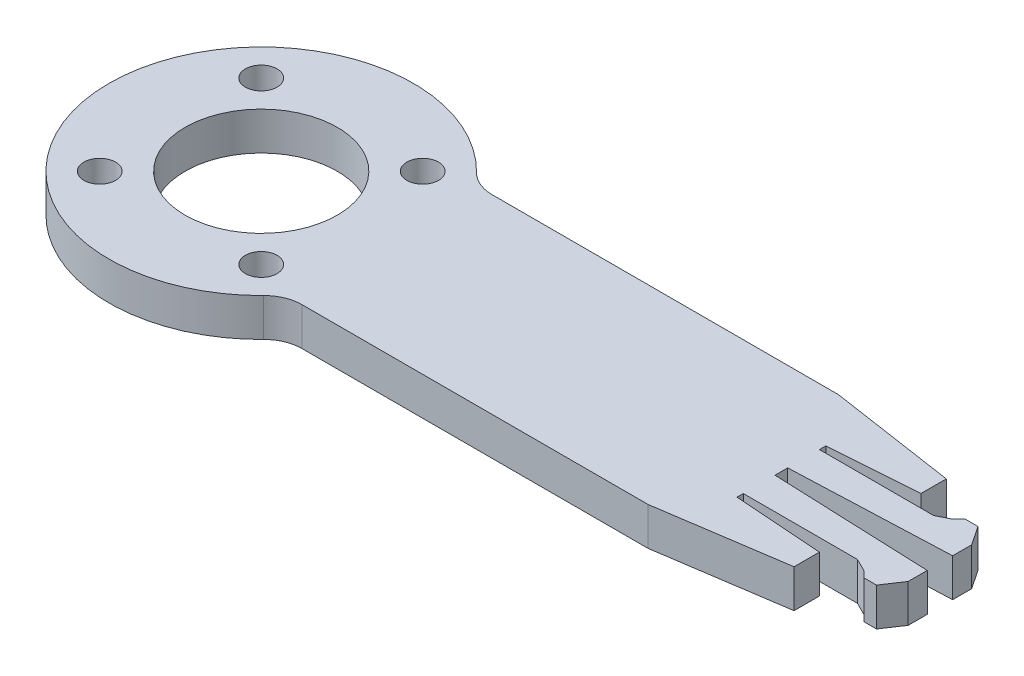
ISO-10303-21;
HEADER;
FILE_DESCRIPTION(('STEP AP214'),'2;1');
FILE_NAME('part.step','',(''),(''),'','','');
FILE_SCHEMA(('AUTOMOTIVE_DESIGN { 1 0 10303 214 1 1 1 1 }'));
ENDSEC;
DATA;
#1=APPLICATION_CONTEXT('core data for automotive mechanical design processes');
#2=APPLICATION_PROTOCOL_DEFINITION('international standard','automotive_design',2000,#1);
#3=PRODUCT_CONTEXT('',#1,'mechanical');
#4=PRODUCT('Part','Part','',(#3));
#5=PRODUCT_RELATED_PRODUCT_CATEGORY('part','',(#4));
#6=PRODUCT_DEFINITION_FORMATION('','',#4);
#7=PRODUCT_DEFINITION_CONTEXT('part definition',#1,'design');
#8=PRODUCT_DEFINITION('design','',#6,#7);
#9=PRODUCT_DEFINITION_SHAPE('','',#8);
#10=(LENGTH_UNIT() NAMED_UNIT(*) SI_UNIT(.MILLI.,.METRE.));
#11=(NAMED_UNIT(*) PLANE_ANGLE_UNIT() SI_UNIT($,.RADIAN.));
#12=(NAMED_UNIT(*) SI_UNIT($,.STERADIAN.) SOLID_ANGLE_UNIT());
#13=UNCERTAINTY_MEASURE_WITH_UNIT(LENGTH_MEASURE(1.E-05),#10,'distance_accuracy_value','');
#14=(GEOMETRIC_REPRESENTATION_CONTEXT(3) GLOBAL_UNCERTAINTY_ASSIGNED_CONTEXT((#13)) GLOBAL_UNIT_ASSIGNED_CONTEXT((#10,
#11,#12)) REPRESENTATION_CONTEXT('',''));
#15=CARTESIAN_POINT('',(0.,0.,0.));
#16=DIRECTION('',(0.,0.,1.));
#17=DIRECTION('',(1.,0.,0.));
#18=AXIS2_PLACEMENT_3D('',#15,#16,#17);
#19=CARTESIAN_POINT('',(1.93643031784841,1.5,12.9095354523227));
#20=DIRECTION('',(0.148340452930245,0.,0.988936352868298));
#21=DIRECTION('',(0.988936352868298,0.,-0.148340452930245));
#22=AXIS2_PLACEMENT_3D('',#19,#20,#21);
#23=PLANE('',#22);
#24=DIRECTION('',(-0.988936352868298,0.,0.148340452930245));
#25=VECTOR('',#24,1.);
#26=CARTESIAN_POINT('',(1.93643031784841,-1.5,12.9095354523227));
#27=LINE('',#26,#25);
#28=CARTESIAN_POINT('',(48.,-1.5,6.));
#29=VERTEX_POINT('',#28);
#30=CARTESIAN_POINT('',(38.,-1.5,7.5));
#31=VERTEX_POINT('',#30);
#32=EDGE_CURVE('E225',#29,#31,#27,.T.);
#33=ORIENTED_EDGE('',*,*,#32,.F.);
#34=DIRECTION('',(0.,-1.,0.));
#35=VECTOR('',#34,1.);
#36=CARTESIAN_POINT('',(48.,1.5,6.));
#37=LINE('',#36,#35);
#38=CARTESIAN_POINT('',(48.,1.5,6.));
#39=VERTEX_POINT('',#38);
#40=EDGE_CURVE('E220',#39,#29,#37,.T.);
#41=ORIENTED_EDGE('',*,*,#40,.F.);
#42=DIRECTION('',(-0.988936352868298,0.,0.148340452930245));
#43=VECTOR('',#42,1.);
#44=CARTESIAN_POINT('',(1.93643031784841,1.5,12.9095354523227));
#45=LINE('',#44,#43);
#46=CARTESIAN_POINT('',(38.,1.5,7.5));
#47=VERTEX_POINT('',#46);
#48=EDGE_CURVE('E223',#39,#47,#45,.T.);
#49=ORIENTED_EDGE('',*,*,#48,.T.);
#50=DIRECTION('',(0.,-1.,0.));
#51=VECTOR('',#50,1.);
#52=CARTESIAN_POINT('',(38.,1.5,7.5));
#53=LINE('',#52,#51);
#54=EDGE_CURVE('E321',#47,#31,#53,.T.);
#55=ORIENTED_EDGE('',*,*,#54,.T.);
#56=EDGE_LOOP('',(#33,#41,#49,#55));
#57=FACE_BOUND('',#56,.T.);
#58=ADVANCED_FACE('F37',(#57),#23,.T.);
#59=CARTESIAN_POINT('',(48.,1.5,0.));
#60=DIRECTION('',(1.,0.,0.));
#61=DIRECTION('',(0.,0.,-1.));
#62=AXIS2_PLACEMENT_3D('',#59,#60,#61);
#63=PLANE('',#62);
#64=DIRECTION('',(0.,0.,1.));
#65=VECTOR('',#64,1.);
#66=CARTESIAN_POINT('',(48.,-1.5,0.));
#67=LINE('',#66,#65);
#68=CARTESIAN_POINT('',(48.,-1.5,4.));
#69=VERTEX_POINT('',#68);
#70=EDGE_CURVE('E323',#69,#29,#67,.T.);
#71=ORIENTED_EDGE('',*,*,#70,.F.);
#72=DIRECTION('',(0.,-1.,0.));
#73=VECTOR('',#72,1.);
#74=CARTESIAN_POINT('',(48.,1.5,4.));
#75=LINE('',#74,#73);
#76=CARTESIAN_POINT('',(48.,1.5,4.));
#77=VERTEX_POINT('',#76);
#78=EDGE_CURVE('E231',#77,#69,#75,.T.);
#79=ORIENTED_EDGE('',*,*,#78,.F.);
#80=DIRECTION('',(0.,0.,1.));
#81=VECTOR('',#80,1.);
#82=CARTESIAN_POINT('',(48.,1.5,0.));
#83=LINE('',#82,#81);
#84=EDGE_CURVE('E238',#77,#39,#83,.T.);
#85=ORIENTED_EDGE('',*,*,#84,.T.);
#86=ORIENTED_EDGE('',*,*,#40,.T.);
#87=EDGE_LOOP('',(#71,#79,#85,#86));
#88=FACE_BOUND('',#87,.T.);
#89=ADVANCED_FACE('F245',(#88),#63,.T.);
#90=CARTESIAN_POINT('',(-0.0406091370558376,1.5,0.568527918781726));
#91=DIRECTION('',(0.0712470499879096,0.,-0.997458699830735));
#92=DIRECTION('',(-0.997458699830735,0.,-0.0712470499879096));
#93=AXIS2_PLACEMENT_3D('',#90,#91,#92);
#94=PLANE('',#93);
#95=DIRECTION('',(0.997458699830735,0.,0.0712470499879096));
#96=VECTOR('',#95,1.);
#97=CARTESIAN_POINT('',(-0.0406091370558376,-1.5,0.568527918781726));
#98=LINE('',#97,#96);
#99=CARTESIAN_POINT('',(41.,-1.5,3.5));
#100=VERTEX_POINT('',#99);
#101=EDGE_CURVE('E325',#100,#69,#98,.T.);
#102=ORIENTED_EDGE('',*,*,#101,.F.);
#103=DIRECTION('',(0.,-1.,0.));
#104=VECTOR('',#103,1.);
#105=CARTESIAN_POINT('',(41.,1.5,3.5));
#106=LINE('',#105,#104);
#107=CARTESIAN_POINT('',(41.,1.5,3.5));
#108=VERTEX_POINT('',#107);
#109=EDGE_CURVE('E451',#108,#100,#106,.T.);
#110=ORIENTED_EDGE('',*,*,#109,.F.);
#111=DIRECTION('',(0.997458699830735,0.,0.0712470499879096));
#112=VECTOR('',#111,1.);
#113=CARTESIAN_POINT('',(-0.0406091370558376,1.5,0.568527918781726));
#114=LINE('',#113,#112);
#115=EDGE_CURVE('E246',#108,#77,#114,.T.);
#116=ORIENTED_EDGE('',*,*,#115,.T.);
#117=ORIENTED_EDGE('',*,*,#78,.T.);
#118=EDGE_LOOP('',(#102,#110,#116,#117));
#119=FACE_BOUND('',#118,.T.);
#120=ADVANCED_FACE('F574',(#119),#94,.T.);
#121=CARTESIAN_POINT('',(41.,1.5,-5.68989300120392E-13));
#122=DIRECTION('',(1.,0.,0.));
#123=DIRECTION('',(0.,0.,-1.));
#124=AXIS2_PLACEMENT_3D('',#121,#122,#123);
#125=PLANE('',#124);
#126=DIRECTION('',(0.,0.,1.));
#127=VECTOR('',#126,1.);
#128=CARTESIAN_POINT('',(41.,-1.5,-5.68989300120392E-13));
#129=LINE('',#128,#127);
#130=CARTESIAN_POINT('',(41.,-1.5,3.));
#131=VERTEX_POINT('',#130);
#132=EDGE_CURVE('E328',#131,#100,#129,.T.);
#133=ORIENTED_EDGE('',*,*,#132,.F.);
#134=DIRECTION('',(0.,-1.,0.));
#135=VECTOR('',#134,1.);
#136=CARTESIAN_POINT('',(41.,1.5,3.));
#137=LINE('',#136,#135);
#138=CARTESIAN_POINT('',(41.,1.5,3.));
#139=VERTEX_POINT('',#138);
#140=EDGE_CURVE('E449',#139,#131,#137,.T.);
#141=ORIENTED_EDGE('',*,*,#140,.F.);
#142=DIRECTION('',(0.,0.,1.));
#143=VECTOR('',#142,1.);
#144=CARTESIAN_POINT('',(41.,1.5,-5.68989300120392E-13));
#145=LINE('',#144,#143);
#146=EDGE_CURVE('E248',#139,#108,#145,.T.);
#147=ORIENTED_EDGE('',*,*,#146,.T.);
#148=ORIENTED_EDGE('',*,*,#109,.T.);
#149=EDGE_LOOP('',(#133,#141,#147,#148));
#150=FACE_BOUND('',#149,.T.);
#151=ADVANCED_FACE('F571',(#150),#125,.T.);
#152=CARTESIAN_POINT('',(0.,1.5,2.99999999999999));
#153=DIRECTION('',(0.,0.,1.));
#154=DIRECTION('',(1.,0.,0.));
#155=AXIS2_PLACEMENT_3D('',#152,#153,#154);
#156=PLANE('',#155);
#157=DIRECTION('',(-1.,0.,0.));
#158=VECTOR('',#157,1.);
#159=CARTESIAN_POINT('',(0.,-1.5,2.99999999999999));
#160=LINE('',#159,#158);
#161=CARTESIAN_POINT('',(50.,-1.5,3.));
#162=VERTEX_POINT('',#161);
#163=EDGE_CURVE('E331',#162,#131,#160,.T.);
#164=ORIENTED_EDGE('',*,*,#163,.F.);
#165=DIRECTION('',(0.,-1.,0.));
#166=VECTOR('',#165,1.);
#167=CARTESIAN_POINT('',(50.,1.5,3.));
#168=LINE('',#167,#166);
#169=CARTESIAN_POINT('',(50.,1.5,3.));
#170=VERTEX_POINT('',#169);
#171=EDGE_CURVE('E447',#170,#162,#168,.T.);
#172=ORIENTED_EDGE('',*,*,#171,.F.);
#173=DIRECTION('',(-1.,0.,0.));
#174=VECTOR('',#173,1.);
#175=CARTESIAN_POINT('',(0.,1.5,2.99999999999999));
#176=LINE('',#175,#174);
#177=EDGE_CURVE('E253',#170,#139,#176,.T.);
#178=ORIENTED_EDGE('',*,*,#177,.T.);
#179=ORIENTED_EDGE('',*,*,#140,.T.);
#180=EDGE_LOOP('',(#164,#172,#178,#179));
#181=FACE_BOUND('',#180,.T.);
#182=ADVANCED_FACE('F567',(#181),#156,.T.);
#183=CARTESIAN_POINT('',(8.79999999999998,1.5,-17.6));
#184=DIRECTION('',(-0.447213595499958,0.,0.894427190999916));
#185=DIRECTION('',(0.894427190999916,0.,0.447213595499958));
#186=AXIS2_PLACEMENT_3D('',#183,#184,#185);
#187=PLANE('',#186);
#188=DIRECTION('',(-0.894427190999916,0.,-0.447213595499958));
#189=VECTOR('',#188,1.);
#190=CARTESIAN_POINT('',(8.79999999999998,-1.5,-17.6));
#191=LINE('',#190,#189);
#192=CARTESIAN_POINT('',(51.,-1.5,3.5));
#193=VERTEX_POINT('',#192);
#194=EDGE_CURVE('E334',#193,#162,#191,.T.);
#195=ORIENTED_EDGE('',*,*,#194,.F.);
#196=DIRECTION('',(0.,-1.,0.));
#197=VECTOR('',#196,1.);
#198=CARTESIAN_POINT('',(51.,1.5,3.5));
#199=LINE('',#198,#197);
#200=CARTESIAN_POINT('',(51.,1.5,3.5));
#201=VERTEX_POINT('',#200);
#202=EDGE_CURVE('E445',#201,#193,#199,.T.);
#203=ORIENTED_EDGE('',*,*,#202,.F.);
#204=DIRECTION('',(-0.894427190999916,0.,-0.447213595499958));
#205=VECTOR('',#204,1.);
#206=CARTESIAN_POINT('',(8.79999999999998,1.5,-17.6));
#207=LINE('',#206,#205);
#208=EDGE_CURVE('E256',#201,#170,#207,.T.);
#209=ORIENTED_EDGE('',*,*,#208,.T.);
#210=ORIENTED_EDGE('',*,*,#171,.T.);
#211=EDGE_LOOP('',(#195,#203,#209,#210));
#212=FACE_BOUND('',#211,.T.);
#213=ADVANCED_FACE('F563',(#212),#187,.T.);
#214=CARTESIAN_POINT('',(23.75,1.5,-23.75));
#215=DIRECTION('',(-0.707106781186547,0.,0.707106781186548));
#216=DIRECTION('',(0.707106781186548,0.,0.707106781186547));
#217=AXIS2_PLACEMENT_3D('',#214,#215,#216);
#218=PLANE('',#217);
#219=DIRECTION('',(-0.707106781186548,0.,-0.707106781186547));
#220=VECTOR('',#219,1.);
#221=CARTESIAN_POINT('',(23.75,-1.5,-23.75));
#222=LINE('',#221,#220);
#223=CARTESIAN_POINT('',(51.5,-1.5,4.));
#224=VERTEX_POINT('',#223);
#225=EDGE_CURVE('E337',#224,#193,#222,.T.);
#226=ORIENTED_EDGE('',*,*,#225,.F.);
#227=DIRECTION('',(0.,-1.,0.));
#228=VECTOR('',#227,1.);
#229=CARTESIAN_POINT('',(51.5,1.5,4.));
#230=LINE('',#229,#228);
#231=CARTESIAN_POINT('',(51.5,1.5,4.));
#232=VERTEX_POINT('',#231);
#233=EDGE_CURVE('E443',#232,#224,#230,.T.);
#234=ORIENTED_EDGE('',*,*,#233,.F.);
#235=DIRECTION('',(-0.707106781186548,0.,-0.707106781186547));
#236=VECTOR('',#235,1.);
#237=CARTESIAN_POINT('',(23.75,1.5,-23.75));
#238=LINE('',#237,#236);
#239=EDGE_CURVE('E259',#232,#201,#238,.T.);
#240=ORIENTED_EDGE('',*,*,#239,.T.);
#241=ORIENTED_EDGE('',*,*,#202,.T.);
#242=EDGE_LOOP('',(#226,#234,#240,#241));
#243=FACE_BOUND('',#242,.T.);
#244=ADVANCED_FACE('F559',(#243),#218,.T.);
#245=CARTESIAN_POINT('',(0.,1.5,3.99999999999996));
#246=DIRECTION('',(0.,0.,1.));
#247=DIRECTION('',(1.,0.,0.));
#248=AXIS2_PLACEMENT_3D('',#245,#246,#247);
#249=PLANE('',#248);
#250=DIRECTION('',(-1.,0.,0.));
#251=VECTOR('',#250,1.);
#252=CARTESIAN_POINT('',(0.,-1.5,3.99999999999996));
#253=LINE('',#252,#251);
#254=CARTESIAN_POINT('',(52.5,-1.5,4.));
#255=VERTEX_POINT('',#254);
#256=EDGE_CURVE('E340',#255,#224,#253,.T.);
#257=ORIENTED_EDGE('',*,*,#256,.F.);
#258=DIRECTION('',(0.,-1.,0.));
#259=VECTOR('',#258,1.);
#260=CARTESIAN_POINT('',(52.5,1.5,4.));
#261=LINE('',#260,#259);
#262=CARTESIAN_POINT('',(52.5,1.5,4.));
#263=VERTEX_POINT('',#262);
#264=EDGE_CURVE('E441',#263,#255,#261,.T.);
#265=ORIENTED_EDGE('',*,*,#264,.F.);
#266=DIRECTION('',(-1.,0.,0.));
#267=VECTOR('',#266,1.);
#268=CARTESIAN_POINT('',(0.,1.5,3.99999999999996));
#269=LINE('',#268,#267);
#270=EDGE_CURVE('E262',#263,#232,#269,.T.);
#271=ORIENTED_EDGE('',*,*,#270,.T.);
#272=ORIENTED_EDGE('',*,*,#233,.T.);
#273=EDGE_LOOP('',(#257,#265,#271,#272));
#274=FACE_BOUND('',#273,.T.);
#275=ADVANCED_FACE('F555',(#274),#249,.T.);
#276=CARTESIAN_POINT('',(38.1923076923077,1.5,25.4615384615385));
#277=DIRECTION('',(0.832050294337844,0.,0.554700196225229));
#278=DIRECTION('',(0.554700196225229,0.,-0.832050294337843));
#279=AXIS2_PLACEMENT_3D('',#276,#277,#278);
#280=PLANE('',#279);
#281=DIRECTION('',(-0.554700196225229,0.,0.832050294337844));
#282=VECTOR('',#281,1.);
#283=CARTESIAN_POINT('',(38.1923076923077,-1.5,25.4615384615385));
#284=LINE('',#283,#282);
#285=CARTESIAN_POINT('',(53.5,-1.5,2.5));
#286=VERTEX_POINT('',#285);
#287=EDGE_CURVE('E343',#286,#255,#284,.T.);
#288=ORIENTED_EDGE('',*,*,#287,.F.);
#289=DIRECTION('',(0.,-1.,0.));
#290=VECTOR('',#289,1.);
#291=CARTESIAN_POINT('',(53.5,1.5,2.5));
#292=LINE('',#291,#290);
#293=CARTESIAN_POINT('',(53.5,1.5,2.5));
#294=VERTEX_POINT('',#293);
#295=EDGE_CURVE('E439',#294,#286,#292,.T.);
#296=ORIENTED_EDGE('',*,*,#295,.F.);
#297=DIRECTION('',(-0.554700196225229,0.,0.832050294337844));
#298=VECTOR('',#297,1.);
#299=CARTESIAN_POINT('',(38.1923076923077,1.5,25.4615384615385));
#300=LINE('',#299,#298);
#301=EDGE_CURVE('E265',#294,#263,#300,.T.);
#302=ORIENTED_EDGE('',*,*,#301,.T.);
#303=ORIENTED_EDGE('',*,*,#264,.T.);
#304=EDGE_LOOP('',(#288,#296,#302,#303));
#305=FACE_BOUND('',#304,.T.);
#306=ADVANCED_FACE('F551',(#305),#280,.T.);
#307=CARTESIAN_POINT('',(53.5,1.5,0.));
#308=DIRECTION('',(1.,0.,0.));
#309=DIRECTION('',(0.,0.,-1.));
#310=AXIS2_PLACEMENT_3D('',#307,#308,#309);
#311=PLANE('',#310);
#312=DIRECTION('',(0.,0.,1.));
#313=VECTOR('',#312,1.);
#314=CARTESIAN_POINT('',(53.5,-1.5,0.));
#315=LINE('',#314,#313);
#316=CARTESIAN_POINT('',(53.5,-1.5,1.));
#317=VERTEX_POINT('',#316);
#318=EDGE_CURVE('E346',#317,#286,#315,.T.);
#319=ORIENTED_EDGE('',*,*,#318,.F.);
#320=DIRECTION('',(0.,-1.,0.));
#321=VECTOR('',#320,1.);
#322=CARTESIAN_POINT('',(53.5,1.5,1.));
#323=LINE('',#322,#321);
#324=CARTESIAN_POINT('',(53.5,1.5,1.));
#325=VERTEX_POINT('',#324);
#326=EDGE_CURVE('E437',#325,#317,#323,.T.);
#327=ORIENTED_EDGE('',*,*,#326,.F.);
#328=DIRECTION('',(0.,0.,1.));
#329=VECTOR('',#328,1.);
#330=CARTESIAN_POINT('',(53.5,1.5,0.));
#331=LINE('',#330,#329);
#332=EDGE_CURVE('E268',#325,#294,#331,.T.);
#333=ORIENTED_EDGE('',*,*,#332,.T.);
#334=ORIENTED_EDGE('',*,*,#295,.T.);
#335=EDGE_LOOP('',(#319,#327,#333,#334));
#336=FACE_BOUND('',#335,.T.);
#337=ADVANCED_FACE('F547',(#336),#311,.T.);
#338=CARTESIAN_POINT('',(0.0455271565495208,1.5,-1.13817891373802));
#339=DIRECTION('',(0.0399680383488716,0.,-0.999200958721789));
#340=DIRECTION('',(-0.99920095872179,0.,-0.0399680383488716));
#341=AXIS2_PLACEMENT_3D('',#338,#339,#340);
#342=PLANE('',#341);
#343=DIRECTION('',(0.99920095872179,0.,0.0399680383488716));
#344=VECTOR('',#343,1.);
#345=CARTESIAN_POINT('',(0.0455271565495208,-1.5,-1.13817891373802));
#346=LINE('',#345,#344);
#347=CARTESIAN_POINT('',(41.,-1.5,0.5));
#348=VERTEX_POINT('',#347);
#349=EDGE_CURVE('E349',#348,#317,#346,.T.);
#350=ORIENTED_EDGE('',*,*,#349,.F.);
#351=DIRECTION('',(0.,-1.,0.));
#352=VECTOR('',#351,1.);
#353=CARTESIAN_POINT('',(41.,1.5,0.5));
#354=LINE('',#353,#352);
#355=CARTESIAN_POINT('',(41.,1.5,0.5));
#356=VERTEX_POINT('',#355);
#357=EDGE_CURVE('E435',#356,#348,#354,.T.);
#358=ORIENTED_EDGE('',*,*,#357,.F.);
#359=DIRECTION('',(0.99920095872179,0.,0.0399680383488716));
#360=VECTOR('',#359,1.);
#361=CARTESIAN_POINT('',(0.0455271565495208,1.5,-1.13817891373802));
#362=LINE('',#361,#360);
#363=EDGE_CURVE('E271',#356,#325,#362,.T.);
#364=ORIENTED_EDGE('',*,*,#363,.T.);
#365=ORIENTED_EDGE('',*,*,#326,.T.);
#366=EDGE_LOOP('',(#350,#358,#364,#365));
#367=FACE_BOUND('',#366,.T.);
#368=ADVANCED_FACE('F543',(#367),#342,.T.);
#369=CARTESIAN_POINT('',(41.,1.5,0.));
#370=DIRECTION('',(1.,0.,0.));
#371=DIRECTION('',(0.,0.,-1.));
#372=AXIS2_PLACEMENT_3D('',#369,#370,#371);
#373=PLANE('',#372);
#374=DIRECTION('',(0.,0.,1.));
#375=VECTOR('',#374,1.);
#376=CARTESIAN_POINT('',(41.,-1.5,0.));
#377=LINE('',#376,#375);
#378=CARTESIAN_POINT('',(41.,-1.5,-0.5));
#379=VERTEX_POINT('',#378);
#380=EDGE_CURVE('E352',#379,#348,#377,.T.);
#381=ORIENTED_EDGE('',*,*,#380,.F.);
#382=DIRECTION('',(0.,-1.,0.));
#383=VECTOR('',#382,1.);
#384=CARTESIAN_POINT('',(41.,1.5,-0.5));
#385=LINE('',#384,#383);
#386=CARTESIAN_POINT('',(41.,1.5,-0.5));
#387=VERTEX_POINT('',#386);
#388=EDGE_CURVE('E433',#387,#379,#385,.T.);
#389=ORIENTED_EDGE('',*,*,#388,.F.);
#390=DIRECTION('',(0.,0.,1.));
#391=VECTOR('',#390,1.);
#392=CARTESIAN_POINT('',(41.,1.5,0.));
#393=LINE('',#392,#391);
#394=EDGE_CURVE('E274',#387,#356,#393,.T.);
#395=ORIENTED_EDGE('',*,*,#394,.T.);
#396=ORIENTED_EDGE('',*,*,#357,.T.);
#397=EDGE_LOOP('',(#381,#389,#395,#396));
#398=FACE_BOUND('',#397,.T.);
#399=ADVANCED_FACE('F537',(#398),#373,.T.);
#400=CARTESIAN_POINT('',(0.0455271565495208,1.5,1.13817891373802));
#401=DIRECTION('',(-0.0399680383488716,0.,-0.999200958721789));
#402=DIRECTION('',(-0.99920095872179,0.,0.0399680383488716));
#403=AXIS2_PLACEMENT_3D('',#400,#401,#402);
#404=PLANE('',#403);
#405=DIRECTION('',(0.99920095872179,0.,-0.0399680383488716));
#406=VECTOR('',#405,1.);
#407=CARTESIAN_POINT('',(0.0455271565495208,-1.5,1.13817891373802));
#408=LINE('',#407,#406);
#409=CARTESIAN_POINT('',(53.5,-1.5,-1.));
#410=VERTEX_POINT('',#409);
#411=EDGE_CURVE('E355',#379,#410,#408,.T.);
#412=ORIENTED_EDGE('',*,*,#411,.T.);
#413=DIRECTION('',(0.,-1.,0.));
#414=VECTOR('',#413,1.);
#415=CARTESIAN_POINT('',(53.5,1.5,-1.));
#416=LINE('',#415,#414);
#417=CARTESIAN_POINT('',(53.5,1.5,-1.));
#418=VERTEX_POINT('',#417);
#419=EDGE_CURVE('E430',#418,#410,#416,.T.);
#420=ORIENTED_EDGE('',*,*,#419,.F.);
#421=DIRECTION('',(0.99920095872179,0.,-0.0399680383488716));
#422=VECTOR('',#421,1.);
#423=CARTESIAN_POINT('',(0.0455271565495208,1.5,1.13817891373802));
#424=LINE('',#423,#422);
#425=EDGE_CURVE('E277',#387,#418,#424,.T.);
#426=ORIENTED_EDGE('',*,*,#425,.F.);
#427=ORIENTED_EDGE('',*,*,#388,.T.);
#428=EDGE_LOOP('',(#412,#420,#426,#427));
#429=FACE_BOUND('',#428,.T.);
#430=ADVANCED_FACE('F575',(#429),#404,.F.);
#431=CARTESIAN_POINT('',(53.5,1.5,0.));
#432=DIRECTION('',(-1.,0.,0.));
#433=DIRECTION('',(0.,0.,1.));
#434=AXIS2_PLACEMENT_3D('',#431,#432,#433);
#435=PLANE('',#434);
#436=DIRECTION('',(0.,0.,-1.));
#437=VECTOR('',#436,1.);
#438=CARTESIAN_POINT('',(53.5,-1.5,0.));
#439=LINE('',#438,#437);
#440=CARTESIAN_POINT('',(53.5,-1.5,-2.5));
#441=VERTEX_POINT('',#440);
#442=EDGE_CURVE('E357',#410,#441,#439,.T.);
#443=ORIENTED_EDGE('',*,*,#442,.T.);
#444=DIRECTION('',(0.,-1.,0.));
#445=VECTOR('',#444,1.);
#446=CARTESIAN_POINT('',(53.5,1.5,-2.5));
#447=LINE('',#446,#445);
#448=CARTESIAN_POINT('',(53.5,1.5,-2.5));
#449=VERTEX_POINT('',#448);
#450=EDGE_CURVE('E427',#449,#441,#447,.T.);
#451=ORIENTED_EDGE('',*,*,#450,.F.);
#452=DIRECTION('',(0.,0.,-1.));
#453=VECTOR('',#452,1.);
#454=CARTESIAN_POINT('',(53.5,1.5,0.));
#455=LINE('',#454,#453);
#456=EDGE_CURVE('E279',#418,#449,#455,.T.);
#457=ORIENTED_EDGE('',*,*,#456,.F.);
#458=ORIENTED_EDGE('',*,*,#419,.T.);
#459=EDGE_LOOP('',(#443,#451,#457,#458));
#460=FACE_BOUND('',#459,.T.);
#461=ADVANCED_FACE('F531',(#460),#435,.F.);
#462=CARTESIAN_POINT('',(38.1923076923077,1.5,-25.4615384615385));
#463=DIRECTION('',(-0.832050294337844,0.,0.554700196225229));
#464=DIRECTION('',(0.554700196225229,0.,0.832050294337843));
#465=AXIS2_PLACEMENT_3D('',#462,#463,#464);
#466=PLANE('',#465);
#467=DIRECTION('',(-0.554700196225229,0.,-0.832050294337844));
#468=VECTOR('',#467,1.);
#469=CARTESIAN_POINT('',(38.1923076923077,-1.5,-25.4615384615385));
#470=LINE('',#469,#468);
#471=CARTESIAN_POINT('',(52.5,-1.5,-4.));
#472=VERTEX_POINT('',#471);
#473=EDGE_CURVE('E359',#441,#472,#470,.T.);
#474=ORIENTED_EDGE('',*,*,#473,.T.);
#475=DIRECTION('',(0.,-1.,0.));
#476=VECTOR('',#475,1.);
#477=CARTESIAN_POINT('',(52.5,1.5,-4.));
#478=LINE('',#477,#476);
#479=CARTESIAN_POINT('',(52.5,1.5,-4.));
#480=VERTEX_POINT('',#479);
#481=EDGE_CURVE('E424',#480,#472,#478,.T.);
#482=ORIENTED_EDGE('',*,*,#481,.F.);
#483=DIRECTION('',(-0.554700196225229,0.,-0.832050294337844));
#484=VECTOR('',#483,1.);
#485=CARTESIAN_POINT('',(38.1923076923077,1.5,-25.4615384615385));
#486=LINE('',#485,#484);
#487=EDGE_CURVE('E281',#449,#480,#486,.T.);
#488=ORIENTED_EDGE('',*,*,#487,.F.);
#489=ORIENTED_EDGE('',*,*,#450,.T.);
#490=EDGE_LOOP('',(#474,#482,#488,#489));
#491=FACE_BOUND('',#490,.T.);
#492=ADVANCED_FACE('F527',(#491),#466,.F.);
#493=CARTESIAN_POINT('',(0.,1.5,-3.99999999999996));
#494=DIRECTION('',(0.,0.,1.));
#495=DIRECTION('',(1.,0.,0.));
#496=AXIS2_PLACEMENT_3D('',#493,#494,#495);
#497=PLANE('',#496);
#498=DIRECTION('',(-1.,0.,0.));
#499=VECTOR('',#498,1.);
#500=CARTESIAN_POINT('',(0.,-1.5,-3.99999999999996));
#501=LINE('',#500,#499);
#502=CARTESIAN_POINT('',(51.5,-1.5,-4.));
#503=VERTEX_POINT('',#502);
#504=EDGE_CURVE('E361',#472,#503,#501,.T.);
#505=ORIENTED_EDGE('',*,*,#504,.T.);
#506=DIRECTION('',(0.,-1.,0.));
#507=VECTOR('',#506,1.);
#508=CARTESIAN_POINT('',(51.5,1.5,-4.));
#509=LINE('',#508,#507);
#510=CARTESIAN_POINT('',(51.5,1.5,-4.));
#511=VERTEX_POINT('',#510);
#512=EDGE_CURVE('E421',#511,#503,#509,.T.);
#513=ORIENTED_EDGE('',*,*,#512,.F.);
#514=DIRECTION('',(-1.,0.,0.));
#515=VECTOR('',#514,1.);
#516=CARTESIAN_POINT('',(0.,1.5,-3.99999999999996));
#517=LINE('',#516,#515);
#518=EDGE_CURVE('E283',#480,#511,#517,.T.);
#519=ORIENTED_EDGE('',*,*,#518,.F.);
#520=ORIENTED_EDGE('',*,*,#481,.T.);
#521=EDGE_LOOP('',(#505,#513,#519,#520));
#522=FACE_BOUND('',#521,.T.);
#523=ADVANCED_FACE('F522',(#522),#497,.F.);
#524=CARTESIAN_POINT('',(23.75,1.5,23.75));
#525=DIRECTION('',(0.707106781186547,0.,0.707106781186548));
#526=DIRECTION('',(0.707106781186548,0.,-0.707106781186547));
#527=AXIS2_PLACEMENT_3D('',#524,#525,#526);
#528=PLANE('',#527);
#529=DIRECTION('',(-0.707106781186548,0.,0.707106781186547));
#530=VECTOR('',#529,1.);
#531=CARTESIAN_POINT('',(23.75,-1.5,23.75));
#532=LINE('',#531,#530);
#533=CARTESIAN_POINT('',(51.,-1.5,-3.5));
#534=VERTEX_POINT('',#533);
#535=EDGE_CURVE('E363',#503,#534,#532,.T.);
#536=ORIENTED_EDGE('',*,*,#535,.T.);
#537=DIRECTION('',(0.,-1.,0.));
#538=VECTOR('',#537,1.);
#539=CARTESIAN_POINT('',(51.,1.5,-3.5));
#540=LINE('',#539,#538);
#541=CARTESIAN_POINT('',(51.,1.5,-3.5));
#542=VERTEX_POINT('',#541);
#543=EDGE_CURVE('E418',#542,#534,#540,.T.);
#544=ORIENTED_EDGE('',*,*,#543,.F.);
#545=DIRECTION('',(-0.707106781186548,0.,0.707106781186547));
#546=VECTOR('',#545,1.);
#547=CARTESIAN_POINT('',(23.75,1.5,23.75));
#548=LINE('',#547,#546);
#549=EDGE_CURVE('E285',#511,#542,#548,.T.);
#550=ORIENTED_EDGE('',*,*,#549,.F.);
#551=ORIENTED_EDGE('',*,*,#512,.T.);
#552=EDGE_LOOP('',(#536,#544,#550,#551));
#553=FACE_BOUND('',#552,.T.);
#554=ADVANCED_FACE('F516',(#553),#528,.F.);
#555=CARTESIAN_POINT('',(8.79999999999998,1.5,17.6));
#556=DIRECTION('',(0.447213595499958,0.,0.894427190999916));
#557=DIRECTION('',(0.894427190999916,0.,-0.447213595499958));
#558=AXIS2_PLACEMENT_3D('',#555,#556,#557);
#559=PLANE('',#558);
#560=DIRECTION('',(-0.894427190999916,0.,0.447213595499958));
#561=VECTOR('',#560,1.);
#562=CARTESIAN_POINT('',(8.79999999999998,-1.5,17.6));
#563=LINE('',#562,#561);
#564=CARTESIAN_POINT('',(50.,-1.5,-3.));
#565=VERTEX_POINT('',#564);
#566=EDGE_CURVE('E365',#534,#565,#563,.T.);
#567=ORIENTED_EDGE('',*,*,#566,.T.);
#568=DIRECTION('',(0.,-1.,0.));
#569=VECTOR('',#568,1.);
#570=CARTESIAN_POINT('',(50.,1.5,-3.));
#571=LINE('',#570,#569);
#572=CARTESIAN_POINT('',(50.,1.5,-3.));
#573=VERTEX_POINT('',#572);
#574=EDGE_CURVE('E415',#573,#565,#571,.T.);
#575=ORIENTED_EDGE('',*,*,#574,.F.);
#576=DIRECTION('',(-0.894427190999916,0.,0.447213595499958));
#577=VECTOR('',#576,1.);
#578=CARTESIAN_POINT('',(8.79999999999998,1.5,17.6));
#579=LINE('',#578,#577);
#580=EDGE_CURVE('E287',#542,#573,#579,.T.);
#581=ORIENTED_EDGE('',*,*,#580,.F.);
#582=ORIENTED_EDGE('',*,*,#543,.T.);
#583=EDGE_LOOP('',(#567,#575,#581,#582));
#584=FACE_BOUND('',#583,.T.);
#585=ADVANCED_FACE('F512',(#584),#559,.F.);
#586=CARTESIAN_POINT('',(0.,1.5,-2.99999999999999));
#587=DIRECTION('',(0.,0.,1.));
#588=DIRECTION('',(1.,0.,0.));
#589=AXIS2_PLACEMENT_3D('',#586,#587,#588);
#590=PLANE('',#589);
#591=DIRECTION('',(-1.,0.,0.));
#592=VECTOR('',#591,1.);
#593=CARTESIAN_POINT('',(0.,-1.5,-2.99999999999999));
#594=LINE('',#593,#592);
#595=CARTESIAN_POINT('',(41.,-1.5,-3.));
#596=VERTEX_POINT('',#595);
#597=EDGE_CURVE('E367',#565,#596,#594,.T.);
#598=ORIENTED_EDGE('',*,*,#597,.T.);
#599=DIRECTION('',(0.,-1.,0.));
#600=VECTOR('',#599,1.);
#601=CARTESIAN_POINT('',(41.,1.5,-3.));
#602=LINE('',#601,#600);
#603=CARTESIAN_POINT('',(41.,1.5,-3.));
#604=VERTEX_POINT('',#603);
#605=EDGE_CURVE('E412',#604,#596,#602,.T.);
#606=ORIENTED_EDGE('',*,*,#605,.F.);
#607=DIRECTION('',(-1.,0.,0.));
#608=VECTOR('',#607,1.);
#609=CARTESIAN_POINT('',(0.,1.5,-2.99999999999999));
#610=LINE('',#609,#608);
#611=EDGE_CURVE('E289',#573,#604,#610,.T.);
#612=ORIENTED_EDGE('',*,*,#611,.F.);
#613=ORIENTED_EDGE('',*,*,#574,.T.);
#614=EDGE_LOOP('',(#598,#606,#612,#613));
#615=FACE_BOUND('',#614,.T.);
#616=ADVANCED_FACE('F507',(#615),#590,.F.);
#617=CARTESIAN_POINT('',(41.,1.5,5.68989300120392E-13));
#618=DIRECTION('',(-1.,0.,0.));
#619=DIRECTION('',(0.,0.,1.));
#620=AXIS2_PLACEMENT_3D('',#617,#618,#619);
#621=PLANE('',#620);
#622=DIRECTION('',(0.,0.,-1.));
#623=VECTOR('',#622,1.);
#624=CARTESIAN_POINT('',(41.,-1.5,5.68989300120392E-13));
#625=LINE('',#624,#623);
#626=CARTESIAN_POINT('',(41.,-1.5,-3.5));
#627=VERTEX_POINT('',#626);
#628=EDGE_CURVE('E369',#596,#627,#625,.T.);
#629=ORIENTED_EDGE('',*,*,#628,.T.);
#630=DIRECTION('',(0.,-1.,0.));
#631=VECTOR('',#630,1.);
#632=CARTESIAN_POINT('',(41.,1.5,-3.5));
#633=LINE('',#632,#631);
#634=CARTESIAN_POINT('',(41.,1.5,-3.5));
#635=VERTEX_POINT('',#634);
#636=EDGE_CURVE('E409',#635,#627,#633,.T.);
#637=ORIENTED_EDGE('',*,*,#636,.F.);
#638=DIRECTION('',(0.,0.,-1.));
#639=VECTOR('',#638,1.);
#640=CARTESIAN_POINT('',(41.,1.5,5.68989300120392E-13));
#641=LINE('',#640,#639);
#642=EDGE_CURVE('E291',#604,#635,#641,.T.);
#643=ORIENTED_EDGE('',*,*,#642,.F.);
#644=ORIENTED_EDGE('',*,*,#605,.T.);
#645=EDGE_LOOP('',(#629,#637,#643,#644));
#646=FACE_BOUND('',#645,.T.);
#647=ADVANCED_FACE('F501',(#646),#621,.F.);
#648=CARTESIAN_POINT('',(-0.0406091370558376,1.5,-0.568527918781726));
#649=DIRECTION('',(-0.0712470499879096,0.,-0.997458699830735));
#650=DIRECTION('',(-0.997458699830735,0.,0.0712470499879096));
#651=AXIS2_PLACEMENT_3D('',#648,#649,#650);
#652=PLANE('',#651);
#653=DIRECTION('',(0.997458699830735,0.,-0.0712470499879096));
#654=VECTOR('',#653,1.);
#655=CARTESIAN_POINT('',(-0.0406091370558376,-1.5,-0.568527918781726));
#656=LINE('',#655,#654);
#657=CARTESIAN_POINT('',(48.,-1.5,-4.));
#658=VERTEX_POINT('',#657);
#659=EDGE_CURVE('E371',#627,#658,#656,.T.);
#660=ORIENTED_EDGE('',*,*,#659,.T.);
#661=DIRECTION('',(0.,-1.,0.));
#662=VECTOR('',#661,1.);
#663=CARTESIAN_POINT('',(48.,1.5,-4.));
#664=LINE('',#663,#662);
#665=CARTESIAN_POINT('',(48.,1.5,-4.));
#666=VERTEX_POINT('',#665);
#667=EDGE_CURVE('E406',#666,#658,#664,.T.);
#668=ORIENTED_EDGE('',*,*,#667,.F.);
#669=DIRECTION('',(0.997458699830735,0.,-0.0712470499879096));
#670=VECTOR('',#669,1.);
#671=CARTESIAN_POINT('',(-0.0406091370558376,1.5,-0.568527918781726));
#672=LINE('',#671,#670);
#673=EDGE_CURVE('E293',#635,#666,#672,.T.);
#674=ORIENTED_EDGE('',*,*,#673,.F.);
#675=ORIENTED_EDGE('',*,*,#636,.T.);
#676=EDGE_LOOP('',(#660,#668,#674,#675));
#677=FACE_BOUND('',#676,.T.);
#678=ADVANCED_FACE('F497',(#677),#652,.F.);
#679=CARTESIAN_POINT('',(48.,1.5,0.));
#680=DIRECTION('',(-1.,0.,0.));
#681=DIRECTION('',(0.,0.,1.));
#682=AXIS2_PLACEMENT_3D('',#679,#680,#681);
#683=PLANE('',#682);
#684=DIRECTION('',(0.,0.,-1.));
#685=VECTOR('',#684,1.);
#686=CARTESIAN_POINT('',(48.,-1.5,0.));
#687=LINE('',#686,#685);
#688=CARTESIAN_POINT('',(48.,-1.5,-6.));
#689=VERTEX_POINT('',#688);
#690=EDGE_CURVE('E373',#658,#689,#687,.T.);
#691=ORIENTED_EDGE('',*,*,#690,.T.);
#692=DIRECTION('',(0.,-1.,0.));
#693=VECTOR('',#692,1.);
#694=CARTESIAN_POINT('',(48.,1.5,-6.));
#695=LINE('',#694,#693);
#696=CARTESIAN_POINT('',(48.,1.5,-6.));
#697=VERTEX_POINT('',#696);
#698=EDGE_CURVE('E403',#697,#689,#695,.T.);
#699=ORIENTED_EDGE('',*,*,#698,.F.);
#700=DIRECTION('',(0.,0.,-1.));
#701=VECTOR('',#700,1.);
#702=CARTESIAN_POINT('',(48.,1.5,0.));
#703=LINE('',#702,#701);
#704=EDGE_CURVE('E295',#666,#697,#703,.T.);
#705=ORIENTED_EDGE('',*,*,#704,.F.);
#706=ORIENTED_EDGE('',*,*,#667,.T.);
#707=EDGE_LOOP('',(#691,#699,#705,#706));
#708=FACE_BOUND('',#707,.T.);
#709=ADVANCED_FACE('F492',(#708),#683,.F.);
#710=CARTESIAN_POINT('',(1.93643031784841,1.5,-12.9095354523227));
#711=DIRECTION('',(-0.148340452930245,0.,0.988936352868298));
#712=DIRECTION('',(0.988936352868298,0.,0.148340452930245));
#713=AXIS2_PLACEMENT_3D('',#710,#711,#712);
#714=PLANE('',#713);
#715=DIRECTION('',(-0.988936352868298,0.,-0.148340452930245));
#716=VECTOR('',#715,1.);
#717=CARTESIAN_POINT('',(1.93643031784841,-1.5,-12.9095354523227));
#718=LINE('',#717,#716);
#719=CARTESIAN_POINT('',(38.,-1.5,-7.5));
#720=VERTEX_POINT('',#719);
#721=EDGE_CURVE('E375',#689,#720,#718,.T.);
#722=ORIENTED_EDGE('',*,*,#721,.T.);
#723=DIRECTION('',(0.,-1.,0.));
#724=VECTOR('',#723,1.);
#725=CARTESIAN_POINT('',(38.,1.5,-7.5));
#726=LINE('',#725,#724);
#727=CARTESIAN_POINT('',(38.,1.5,-7.5));
#728=VERTEX_POINT('',#727);
#729=EDGE_CURVE('E400',#728,#720,#726,.T.);
#730=ORIENTED_EDGE('',*,*,#729,.F.);
#731=DIRECTION('',(-0.988936352868298,0.,-0.148340452930245));
#732=VECTOR('',#731,1.);
#733=CARTESIAN_POINT('',(1.93643031784841,1.5,-12.9095354523227));
#734=LINE('',#733,#732);
#735=EDGE_CURVE('E297',#697,#728,#734,.T.);
#736=ORIENTED_EDGE('',*,*,#735,.F.);
#737=ORIENTED_EDGE('',*,*,#698,.T.);
#738=EDGE_LOOP('',(#722,#730,#736,#737));
#739=FACE_BOUND('',#738,.T.);
#740=ADVANCED_FACE('F486',(#739),#714,.F.);
#741=CARTESIAN_POINT('',(0.,1.5,-7.5));
#742=DIRECTION('',(0.,0.,-1.));
#743=DIRECTION('',(-1.,0.,0.));
#744=AXIS2_PLACEMENT_3D('',#741,#742,#743);
#745=PLANE('',#744);
#746=DIRECTION('',(1.,0.,0.));
#747=VECTOR('',#746,1.);
#748=CARTESIAN_POINT('',(0.,-1.5,-7.5));
#749=LINE('',#748,#747);
#750=CARTESIAN_POINT('',(10.7121426428143,-1.5,-7.5));
#751=VERTEX_POINT('',#750);
#752=EDGE_CURVE('E378',#751,#720,#749,.T.);
#753=ORIENTED_EDGE('',*,*,#752,.F.);
#754=DIRECTION('',(0.,-1.,0.));
#755=VECTOR('',#754,1.);
#756=CARTESIAN_POINT('',(10.7121426428143,1.5,-7.5));
#757=LINE('',#756,#755);
#758=CARTESIAN_POINT('',(10.7121426428143,1.5,-7.5));
#759=VERTEX_POINT('',#758);
#760=EDGE_CURVE('E52',#751,#759,#757,.F.);
#761=ORIENTED_EDGE('',*,*,#760,.T.);
#762=DIRECTION('',(1.,0.,0.));
#763=VECTOR('',#762,1.);
#764=CARTESIAN_POINT('',(0.,1.5,-7.5));
#765=LINE('',#764,#763);
#766=EDGE_CURVE('E300',#759,#728,#765,.T.);
#767=ORIENTED_EDGE('',*,*,#766,.T.);
#768=ORIENTED_EDGE('',*,*,#729,.T.);
#769=EDGE_LOOP('',(#753,#761,#767,#768));
#770=FACE_BOUND('',#769,.T.);
#771=ADVANCED_FACE('F483',(#770),#745,.T.);
#772=CARTESIAN_POINT('',(0.,1.5,0.));
#773=DIRECTION('',(0.,-1.,0.));
#774=DIRECTION('',(0.,0.,-1.));
#775=AXIS2_PLACEMENT_3D('',#772,#773,#774);
#776=CYLINDRICAL_SURFACE('',#775,12.);
#777=CARTESIAN_POINT('',(0.,-1.5,0.));
#778=DIRECTION('',(0.,1.,0.));
#779=DIRECTION('',(0.,0.,1.));
#780=AXIS2_PLACEMENT_3D('',#777,#778,#779);
#781=CIRCLE('',#780,12.);
#782=CARTESIAN_POINT('',(8.56971411425142,-1.5,-8.4));
#783=VERTEX_POINT('',#782);
#784=CARTESIAN_POINT('',(8.56971411425142,-1.5,8.4));
#785=VERTEX_POINT('',#784);
#786=EDGE_CURVE('E380',#783,#785,#781,.T.);
#787=ORIENTED_EDGE('',*,*,#786,.T.);
#788=DIRECTION('',(0.,-1.,0.));
#789=VECTOR('',#788,1.);
#790=CARTESIAN_POINT('',(8.56971411425142,1.5,8.4));
#791=LINE('',#790,#789);
#792=CARTESIAN_POINT('',(8.56971411425142,1.5,8.4));
#793=VERTEX_POINT('',#792);
#794=EDGE_CURVE('E459',#785,#793,#791,.F.);
#795=ORIENTED_EDGE('',*,*,#794,.T.);
#796=CARTESIAN_POINT('',(0.,1.5,0.));
#797=DIRECTION('',(0.,1.,0.));
#798=DIRECTION('',(0.,0.,1.));
#799=AXIS2_PLACEMENT_3D('',#796,#797,#798);
#800=CIRCLE('',#799,12.);
#801=CARTESIAN_POINT('',(8.56971411425142,1.5,-8.4));
#802=VERTEX_POINT('',#801);
#803=EDGE_CURVE('E302',#802,#793,#800,.T.);
#804=ORIENTED_EDGE('',*,*,#803,.F.);
#805=DIRECTION('',(0.,-1.,0.));
#806=VECTOR('',#805,1.);
#807=CARTESIAN_POINT('',(8.56971411425142,1.5,-8.4));
#808=LINE('',#807,#806);
#809=EDGE_CURVE('E456',#802,#783,#808,.T.);
#810=ORIENTED_EDGE('',*,*,#809,.T.);
#811=EDGE_LOOP('',(#787,#795,#804,#810));
#812=FACE_BOUND('',#811,.T.);
#813=ADVANCED_FACE('F477',(#812),#776,.T.);
#814=CARTESIAN_POINT('',(6.36396103067891,1.5,-6.36396103067894));
#815=DIRECTION('',(0.,-1.,0.));
#816=DIRECTION('',(0.,0.,-1.));
#817=AXIS2_PLACEMENT_3D('',#814,#815,#816);
#818=CYLINDRICAL_SURFACE('',#817,1.25);
#819=CARTESIAN_POINT('',(6.36396103067891,1.5,-6.36396103067894));
#820=DIRECTION('',(0.,1.,0.));
#821=DIRECTION('',(0.,0.,1.));
#822=AXIS2_PLACEMENT_3D('',#819,#820,#821);
#823=CIRCLE('',#822,1.25);
#824=CARTESIAN_POINT('',(6.36396103067891,1.5,-5.11396103067894));
#825=VERTEX_POINT('',#824);
#826=EDGE_CURVE('E315',#825,#825,#823,.T.);
#827=ORIENTED_EDGE('',*,*,#826,.T.);
#828=EDGE_LOOP('',(#827));
#829=FACE_BOUND('',#828,.T.);
#830=CARTESIAN_POINT('',(6.36396103067891,-1.5,-6.36396103067894));
#831=DIRECTION('',(0.,1.,0.));
#832=DIRECTION('',(0.,0.,1.));
#833=AXIS2_PLACEMENT_3D('',#830,#831,#832);
#834=CIRCLE('',#833,1.25);
#835=CARTESIAN_POINT('',(6.36396103067891,-1.5,-5.11396103067894));
#836=VERTEX_POINT('',#835);
#837=EDGE_CURVE('E394',#836,#836,#834,.T.);
#838=ORIENTED_EDGE('',*,*,#837,.F.);
#839=EDGE_LOOP('',(#838));
#840=FACE_BOUND('',#839,.T.);
#841=ADVANCED_FACE('F606',(#829,#840),#818,.F.);
#842=CARTESIAN_POINT('',(-6.36396103067894,1.5,-6.36396103067892));
#843=DIRECTION('',(0.,-1.,0.));
#844=DIRECTION('',(0.,0.,-1.));
#845=AXIS2_PLACEMENT_3D('',#842,#843,#844);
#846=CYLINDRICAL_SURFACE('',#845,1.25);
#847=CARTESIAN_POINT('',(-6.36396103067894,1.5,-6.36396103067892));
#848=DIRECTION('',(0.,1.,0.));
#849=DIRECTION('',(0.,0.,1.));
#850=AXIS2_PLACEMENT_3D('',#847,#848,#849);
#851=CIRCLE('',#850,1.25);
#852=CARTESIAN_POINT('',(-6.36396103067894,1.5,-5.11396103067892));
#853=VERTEX_POINT('',#852);
#854=EDGE_CURVE('E312',#853,#853,#851,.T.);
#855=ORIENTED_EDGE('',*,*,#854,.T.);
#856=EDGE_LOOP('',(#855));
#857=FACE_BOUND('',#856,.T.);
#858=CARTESIAN_POINT('',(-6.36396103067894,-1.5,-6.36396103067892));
#859=DIRECTION('',(0.,1.,0.));
#860=DIRECTION('',(0.,0.,1.));
#861=AXIS2_PLACEMENT_3D('',#858,#859,#860);
#862=CIRCLE('',#861,1.25);
#863=CARTESIAN_POINT('',(-6.36396103067894,-1.5,-5.11396103067892));
#864=VERTEX_POINT('',#863);
#865=EDGE_CURVE('E391',#864,#864,#862,.T.);
#866=ORIENTED_EDGE('',*,*,#865,.F.);
#867=EDGE_LOOP('',(#866));
#868=FACE_BOUND('',#867,.T.);
#869=ADVANCED_FACE('F609',(#857,#868),#846,.F.);
#870=CARTESIAN_POINT('',(-6.36396103067891,1.5,6.36396103067894));
#871=DIRECTION('',(0.,-1.,0.));
#872=DIRECTION('',(0.,0.,-1.));
#873=AXIS2_PLACEMENT_3D('',#870,#871,#872);
#874=CYLINDRICAL_SURFACE('',#873,1.25);
#875=CARTESIAN_POINT('',(-6.36396103067891,1.5,6.36396103067894));
#876=DIRECTION('',(0.,1.,0.));
#877=DIRECTION('',(0.,0.,1.));
#878=AXIS2_PLACEMENT_3D('',#875,#876,#877);
#879=CIRCLE('',#878,1.25);
#880=CARTESIAN_POINT('',(-6.36396103067891,1.5,7.61396103067894));
#881=VERTEX_POINT('',#880);
#882=EDGE_CURVE('E309',#881,#881,#879,.T.);
#883=ORIENTED_EDGE('',*,*,#882,.T.);
#884=EDGE_LOOP('',(#883));
#885=FACE_BOUND('',#884,.T.);
#886=CARTESIAN_POINT('',(-6.36396103067891,-1.5,6.36396103067894));
#887=DIRECTION('',(0.,1.,0.));
#888=DIRECTION('',(0.,0.,1.));
#889=AXIS2_PLACEMENT_3D('',#886,#887,#888);
#890=CIRCLE('',#889,1.25);
#891=CARTESIAN_POINT('',(-6.36396103067891,-1.5,7.61396103067894));
#892=VERTEX_POINT('',#891);
#893=EDGE_CURVE('E388',#892,#892,#890,.T.);
#894=ORIENTED_EDGE('',*,*,#893,.F.);
#895=EDGE_LOOP('',(#894));
#896=FACE_BOUND('',#895,.T.);
#897=ADVANCED_FACE('F613',(#885,#896),#874,.F.);
#898=CARTESIAN_POINT('',(6.36396103067894,1.5,6.36396103067891));
#899=DIRECTION('',(0.,-1.,0.));
#900=DIRECTION('',(0.,0.,-1.));
#901=AXIS2_PLACEMENT_3D('',#898,#899,#900);
#902=CYLINDRICAL_SURFACE('',#901,1.25);
#903=CARTESIAN_POINT('',(6.36396103067894,1.5,6.36396103067891));
#904=DIRECTION('',(0.,1.,0.));
#905=DIRECTION('',(0.,0.,1.));
#906=AXIS2_PLACEMENT_3D('',#903,#904,#905);
#907=CIRCLE('',#906,1.25);
#908=CARTESIAN_POINT('',(6.36396103067894,1.5,7.61396103067892));
#909=VERTEX_POINT('',#908);
#910=EDGE_CURVE('E306',#909,#909,#907,.T.);
#911=ORIENTED_EDGE('',*,*,#910,.T.);
#912=EDGE_LOOP('',(#911));
#913=FACE_BOUND('',#912,.T.);
#914=CARTESIAN_POINT('',(6.36396103067894,-1.5,6.36396103067891));
#915=DIRECTION('',(0.,1.,0.));
#916=DIRECTION('',(0.,0.,1.));
#917=AXIS2_PLACEMENT_3D('',#914,#915,#916);
#918=CIRCLE('',#917,1.25);
#919=CARTESIAN_POINT('',(6.36396103067894,-1.5,7.61396103067892));
#920=VERTEX_POINT('',#919);
#921=EDGE_CURVE('E385',#920,#920,#918,.T.);
#922=ORIENTED_EDGE('',*,*,#921,.F.);
#923=EDGE_LOOP('',(#922));
#924=FACE_BOUND('',#923,.T.);
#925=ADVANCED_FACE('F617',(#913,#924),#902,.F.);
#926=CARTESIAN_POINT('',(0.,1.5,7.5));
#927=DIRECTION('',(0.,0.,-1.));
#928=DIRECTION('',(-1.,0.,0.));
#929=AXIS2_PLACEMENT_3D('',#926,#927,#928);
#930=PLANE('',#929);
#931=DIRECTION('',(1.,0.,0.));
#932=VECTOR('',#931,1.);
#933=CARTESIAN_POINT('',(0.,1.5,7.5));
#934=LINE('',#933,#932);
#935=CARTESIAN_POINT('',(10.7121426428143,1.5,7.5));
#936=VERTEX_POINT('',#935);
#937=EDGE_CURVE('E241',#936,#47,#934,.T.);
#938=ORIENTED_EDGE('',*,*,#937,.F.);
#939=DIRECTION('',(0.,1.,0.));
#940=VECTOR('',#939,1.);
#941=CARTESIAN_POINT('',(10.7121426428143,-1.5,7.5));
#942=LINE('',#941,#940);
#943=CARTESIAN_POINT('',(10.7121426428143,-1.5,7.5));
#944=VERTEX_POINT('',#943);
#945=EDGE_CURVE('E230',#936,#944,#942,.F.);
#946=ORIENTED_EDGE('',*,*,#945,.T.);
#947=DIRECTION('',(1.,0.,0.));
#948=VECTOR('',#947,1.);
#949=CARTESIAN_POINT('',(0.,-1.5,7.5));
#950=LINE('',#949,#948);
#951=EDGE_CURVE('E383',#944,#31,#950,.T.);
#952=ORIENTED_EDGE('',*,*,#951,.T.);
#953=ORIENTED_EDGE('',*,*,#54,.F.);
#954=EDGE_LOOP('',(#938,#946,#952,#953));
#955=FACE_BOUND('',#954,.T.);
#956=ADVANCED_FACE('F471',(#955),#930,.F.);
#957=CARTESIAN_POINT('',(0.,1.5,0.));
#958=DIRECTION('',(0.,-1.,0.));
#959=DIRECTION('',(0.,0.,-1.));
#960=AXIS2_PLACEMENT_3D('',#957,#958,#959);
#961=CYLINDRICAL_SURFACE('',#960,6.);
#962=CARTESIAN_POINT('',(0.,1.5,0.));
#963=DIRECTION('',(0.,1.,0.));
#964=DIRECTION('',(0.,0.,1.));
#965=AXIS2_PLACEMENT_3D('',#962,#963,#964);
#966=CIRCLE('',#965,6.);
#967=CARTESIAN_POINT('',(0.,1.5,6.));
#968=VERTEX_POINT('',#967);
#969=EDGE_CURVE('E318',#968,#968,#966,.T.);
#970=ORIENTED_EDGE('',*,*,#969,.T.);
#971=EDGE_LOOP('',(#970));
#972=FACE_BOUND('',#971,.T.);
#973=CARTESIAN_POINT('',(0.,-1.5,0.));
#974=DIRECTION('',(0.,1.,0.));
#975=DIRECTION('',(0.,0.,1.));
#976=AXIS2_PLACEMENT_3D('',#973,#974,#975);
#977=CIRCLE('',#976,6.);
#978=CARTESIAN_POINT('',(0.,-1.5,6.));
#979=VERTEX_POINT('',#978);
#980=EDGE_CURVE('E243',#979,#979,#977,.T.);
#981=ORIENTED_EDGE('',*,*,#980,.F.);
#982=EDGE_LOOP('',(#981));
#983=FACE_BOUND('',#982,.T.);
#984=ADVANCED_FACE('F600',(#972,#983),#961,.F.);
#985=CARTESIAN_POINT('',(0.,1.5,0.));
#986=DIRECTION('',(0.,1.,0.));
#987=DIRECTION('',(0.,0.,1.));
#988=AXIS2_PLACEMENT_3D('',#985,#986,#987);
#989=PLANE('',#988);
#990=ORIENTED_EDGE('',*,*,#48,.F.);
#991=ORIENTED_EDGE('',*,*,#84,.F.);
#992=ORIENTED_EDGE('',*,*,#115,.F.);
#993=ORIENTED_EDGE('',*,*,#146,.F.);
#994=ORIENTED_EDGE('',*,*,#177,.F.);
#995=ORIENTED_EDGE('',*,*,#208,.F.);
#996=ORIENTED_EDGE('',*,*,#239,.F.);
#997=ORIENTED_EDGE('',*,*,#270,.F.);
#998=ORIENTED_EDGE('',*,*,#301,.F.);
#999=ORIENTED_EDGE('',*,*,#332,.F.);
#1000=ORIENTED_EDGE('',*,*,#363,.F.);
#1001=ORIENTED_EDGE('',*,*,#394,.F.);
#1002=ORIENTED_EDGE('',*,*,#425,.T.);
#1003=ORIENTED_EDGE('',*,*,#456,.T.);
#1004=ORIENTED_EDGE('',*,*,#487,.T.);
#1005=ORIENTED_EDGE('',*,*,#518,.T.);
#1006=ORIENTED_EDGE('',*,*,#549,.T.);
#1007=ORIENTED_EDGE('',*,*,#580,.T.);
#1008=ORIENTED_EDGE('',*,*,#611,.T.);
#1009=ORIENTED_EDGE('',*,*,#642,.T.);
#1010=ORIENTED_EDGE('',*,*,#673,.T.);
#1011=ORIENTED_EDGE('',*,*,#704,.T.);
#1012=ORIENTED_EDGE('',*,*,#735,.T.);
#1013=ORIENTED_EDGE('',*,*,#766,.F.);
#1014=CARTESIAN_POINT('',(10.7121426428143,1.5,-10.5));
#1015=DIRECTION('',(0.,1.,0.));
#1016=DIRECTION('',(0.,0.,1.));
#1017=AXIS2_PLACEMENT_3D('',#1014,#1015,#1016);
#1018=CIRCLE('',#1017,3.);
#1019=EDGE_CURVE('E11',#759,#802,#1018,.F.);
#1020=ORIENTED_EDGE('',*,*,#1019,.T.);
#1021=ORIENTED_EDGE('',*,*,#803,.T.);
#1022=CARTESIAN_POINT('',(10.7121426428143,1.5,10.5));
#1023=DIRECTION('',(0.,1.,0.));
#1024=DIRECTION('',(0.,0.,1.));
#1025=AXIS2_PLACEMENT_3D('',#1022,#1023,#1024);
#1026=CIRCLE('',#1025,3.);
#1027=EDGE_CURVE('E464',#793,#936,#1026,.F.);
#1028=ORIENTED_EDGE('',*,*,#1027,.T.);
#1029=ORIENTED_EDGE('',*,*,#937,.T.);
#1030=EDGE_LOOP('',(#990,#991,#992,#993,#994,#995,#996,#997,#998,#999,#1000,#1001,#1002,#1003,
#1004,#1005,#1006,#1007,#1008,#1009,#1010,#1011,#1012,#1013,#1020,#1021,#1028,#1029));
#1031=FACE_BOUND('',#1030,.T.);
#1032=ORIENTED_EDGE('',*,*,#910,.F.);
#1033=EDGE_LOOP('',(#1032));
#1034=FACE_BOUND('',#1033,.T.);
#1035=ORIENTED_EDGE('',*,*,#882,.F.);
#1036=EDGE_LOOP('',(#1035));
#1037=FACE_BOUND('',#1036,.T.);
#1038=ORIENTED_EDGE('',*,*,#854,.F.);
#1039=EDGE_LOOP('',(#1038));
#1040=FACE_BOUND('',#1039,.T.);
#1041=ORIENTED_EDGE('',*,*,#826,.F.);
#1042=EDGE_LOOP('',(#1041));
#1043=FACE_BOUND('',#1042,.T.);
#1044=ORIENTED_EDGE('',*,*,#969,.F.);
#1045=EDGE_LOOP('',(#1044));
#1046=FACE_BOUND('',#1045,.T.);
#1047=ADVANCED_FACE('F235',(#1031,#1034,#1037,#1040,#1043,#1046),#989,.T.);
#1048=CARTESIAN_POINT('',(0.,-1.5,0.));
#1049=DIRECTION('',(0.,1.,0.));
#1050=DIRECTION('',(0.,0.,1.));
#1051=AXIS2_PLACEMENT_3D('',#1048,#1049,#1050);
#1052=PLANE('',#1051);
#1053=ORIENTED_EDGE('',*,*,#32,.T.);
#1054=ORIENTED_EDGE('',*,*,#951,.F.);
#1055=CARTESIAN_POINT('',(10.7121426428143,-1.5,10.5));
#1056=DIRECTION('',(0.,1.,0.));
#1057=DIRECTION('',(0.,0.,1.));
#1058=AXIS2_PLACEMENT_3D('',#1055,#1056,#1057);
#1059=CIRCLE('',#1058,3.);
#1060=EDGE_CURVE('E462',#944,#785,#1059,.T.);
#1061=ORIENTED_EDGE('',*,*,#1060,.T.);
#1062=ORIENTED_EDGE('',*,*,#786,.F.);
#1063=CARTESIAN_POINT('',(10.7121426428143,-1.5,-10.5));
#1064=DIRECTION('',(0.,1.,0.));
#1065=DIRECTION('',(0.,0.,1.));
#1066=AXIS2_PLACEMENT_3D('',#1063,#1064,#1065);
#1067=CIRCLE('',#1066,3.);
#1068=EDGE_CURVE('E45',#783,#751,#1067,.T.);
#1069=ORIENTED_EDGE('',*,*,#1068,.T.);
#1070=ORIENTED_EDGE('',*,*,#752,.T.);
#1071=ORIENTED_EDGE('',*,*,#721,.F.);
#1072=ORIENTED_EDGE('',*,*,#690,.F.);
#1073=ORIENTED_EDGE('',*,*,#659,.F.);
#1074=ORIENTED_EDGE('',*,*,#628,.F.);
#1075=ORIENTED_EDGE('',*,*,#597,.F.);
#1076=ORIENTED_EDGE('',*,*,#566,.F.);
#1077=ORIENTED_EDGE('',*,*,#535,.F.);
#1078=ORIENTED_EDGE('',*,*,#504,.F.);
#1079=ORIENTED_EDGE('',*,*,#473,.F.);
#1080=ORIENTED_EDGE('',*,*,#442,.F.);
#1081=ORIENTED_EDGE('',*,*,#411,.F.);
#1082=ORIENTED_EDGE('',*,*,#380,.T.);
#1083=ORIENTED_EDGE('',*,*,#349,.T.);
#1084=ORIENTED_EDGE('',*,*,#318,.T.);
#1085=ORIENTED_EDGE('',*,*,#287,.T.);
#1086=ORIENTED_EDGE('',*,*,#256,.T.);
#1087=ORIENTED_EDGE('',*,*,#225,.T.);
#1088=ORIENTED_EDGE('',*,*,#194,.T.);
#1089=ORIENTED_EDGE('',*,*,#163,.T.);
#1090=ORIENTED_EDGE('',*,*,#132,.T.);
#1091=ORIENTED_EDGE('',*,*,#101,.T.);
#1092=ORIENTED_EDGE('',*,*,#70,.T.);
#1093=EDGE_LOOP('',(#1053,#1054,#1061,#1062,#1069,#1070,#1071,#1072,#1073,#1074,#1075,#1076,
#1077,#1078,#1079,#1080,#1081,#1082,#1083,#1084,#1085,#1086,#1087,#1088,#1089,#1090,#1091,#1092));
#1094=FACE_BOUND('',#1093,.T.);
#1095=ORIENTED_EDGE('',*,*,#921,.T.);
#1096=EDGE_LOOP('',(#1095));
#1097=FACE_BOUND('',#1096,.T.);
#1098=ORIENTED_EDGE('',*,*,#893,.T.);
#1099=EDGE_LOOP('',(#1098));
#1100=FACE_BOUND('',#1099,.T.);
#1101=ORIENTED_EDGE('',*,*,#865,.T.);
#1102=EDGE_LOOP('',(#1101));
#1103=FACE_BOUND('',#1102,.T.);
#1104=ORIENTED_EDGE('',*,*,#837,.T.);
#1105=EDGE_LOOP('',(#1104));
#1106=FACE_BOUND('',#1105,.T.);
#1107=ORIENTED_EDGE('',*,*,#980,.T.);
#1108=EDGE_LOOP('',(#1107));
#1109=FACE_BOUND('',#1108,.T.);
#1110=ADVANCED_FACE('F474',(#1094,#1097,#1100,#1103,#1106,#1109),#1052,.F.);
#1111=CARTESIAN_POINT('',(10.7121426428143,1.5,10.5));
#1112=DIRECTION('',(0.,-1.,0.));
#1113=DIRECTION('',(0.,0.,-1.));
#1114=AXIS2_PLACEMENT_3D('',#1111,#1112,#1113);
#1115=CYLINDRICAL_SURFACE('',#1114,3.);
#1116=ORIENTED_EDGE('',*,*,#1027,.F.);
#1117=ORIENTED_EDGE('',*,*,#794,.F.);
#1118=ORIENTED_EDGE('',*,*,#1060,.F.);
#1119=ORIENTED_EDGE('',*,*,#945,.F.);
#1120=EDGE_LOOP('',(#1116,#1117,#1118,#1119));
#1121=FACE_BOUND('',#1120,.T.);
#1122=ADVANCED_FACE('F473',(#1121),#1115,.F.);
#1123=CARTESIAN_POINT('',(10.7121426428143,1.5,-10.5));
#1124=DIRECTION('',(0.,-1.,0.));
#1125=DIRECTION('',(0.,0.,-1.));
#1126=AXIS2_PLACEMENT_3D('',#1123,#1124,#1125);
#1127=CYLINDRICAL_SURFACE('',#1126,3.);
#1128=ORIENTED_EDGE('',*,*,#1019,.F.);
#1129=ORIENTED_EDGE('',*,*,#760,.F.);
#1130=ORIENTED_EDGE('',*,*,#1068,.F.);
#1131=ORIENTED_EDGE('',*,*,#809,.F.);
#1132=EDGE_LOOP('',(#1128,#1129,#1130,#1131));
#1133=FACE_BOUND('',#1132,.T.);
#1134=ADVANCED_FACE('F39',(#1133),#1127,.F.);
#1135=CLOSED_SHELL('',(#58,#89,#120,#151,#182,#213,#244,#275,#306,#337,#368,#399,#430,#461,#492,
#523,#554,#585,#616,#647,#678,#709,#740,#771,#813,#841,#869,#897,#925,#956,#984,#1047,#1110,
#1122,#1134));
#1136=MANIFOLD_SOLID_BREP('B2',#1135);
#1137=ADVANCED_BREP_SHAPE_REPRESENTATION('',(#18,#1136),#14);
#1138=SHAPE_DEFINITION_REPRESENTATION(#9,#1137);
ENDSEC;
END-ISO-10303-21;
